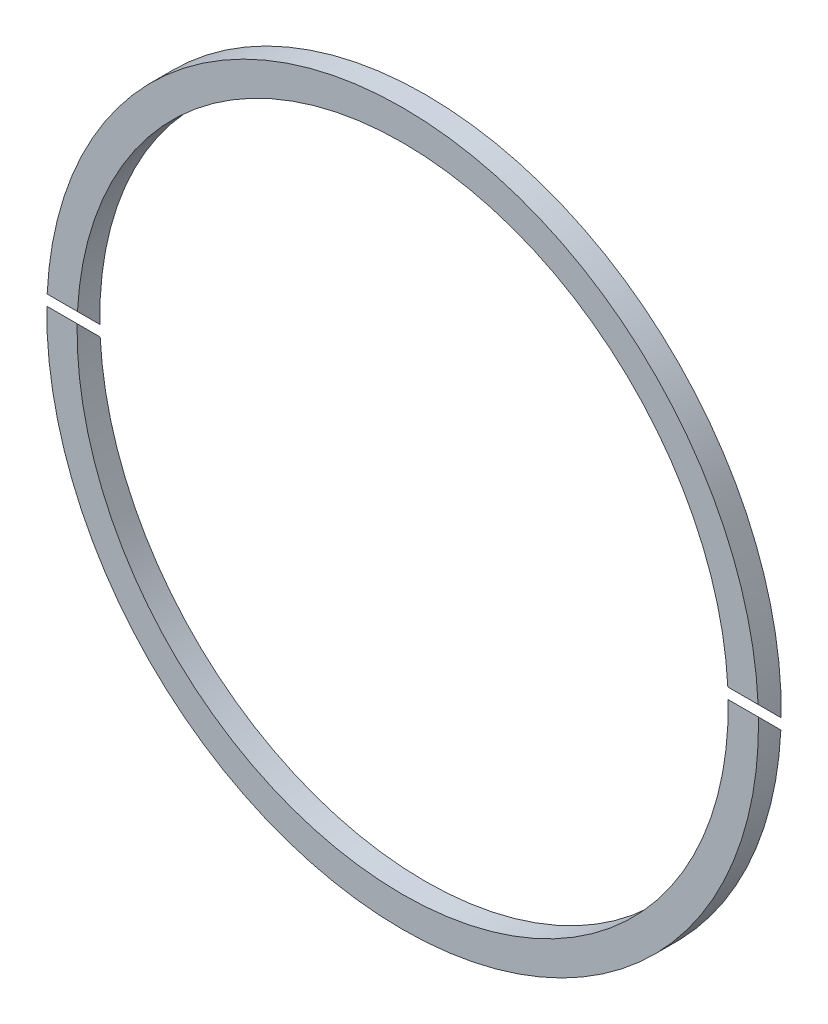
ISO-10303-21;
HEADER;
FILE_DESCRIPTION(('STEP AP214'),'2;1');
FILE_NAME('part.step','',(''),(''),'','','');
FILE_SCHEMA(('AUTOMOTIVE_DESIGN { 1 0 10303 214 1 1 1 1 }'));
ENDSEC;
DATA;
#1=APPLICATION_CONTEXT('core data for automotive mechanical design processes');
#2=APPLICATION_PROTOCOL_DEFINITION('international standard','automotive_design',2000,#1);
#3=PRODUCT_CONTEXT('',#1,'mechanical');
#4=PRODUCT('Part','Part','',(#3));
#5=PRODUCT_RELATED_PRODUCT_CATEGORY('part','',(#4));
#6=PRODUCT_DEFINITION_FORMATION('','',#4);
#7=PRODUCT_DEFINITION_CONTEXT('part definition',#1,'design');
#8=PRODUCT_DEFINITION('design','',#6,#7);
#9=PRODUCT_DEFINITION_SHAPE('','',#8);
#10=(LENGTH_UNIT() NAMED_UNIT(*) SI_UNIT(.MILLI.,.METRE.));
#11=(NAMED_UNIT(*) PLANE_ANGLE_UNIT() SI_UNIT($,.RADIAN.));
#12=(NAMED_UNIT(*) SI_UNIT($,.STERADIAN.) SOLID_ANGLE_UNIT());
#13=UNCERTAINTY_MEASURE_WITH_UNIT(LENGTH_MEASURE(1.E-05),#10,'distance_accuracy_value','');
#14=(GEOMETRIC_REPRESENTATION_CONTEXT(3) GLOBAL_UNCERTAINTY_ASSIGNED_CONTEXT((#13)) GLOBAL_UNIT_ASSIGNED_CONTEXT((#10,
#11,#12)) REPRESENTATION_CONTEXT('',''));
#15=CARTESIAN_POINT('',(0.,0.,0.));
#16=DIRECTION('',(0.,0.,1.));
#17=DIRECTION('',(1.,0.,0.));
#18=AXIS2_PLACEMENT_3D('',#15,#16,#17);
#19=CARTESIAN_POINT('',(0.,0.,1.5));
#20=DIRECTION('',(0.,0.,1.));
#21=DIRECTION('',(1.,0.,0.));
#22=AXIS2_PLACEMENT_3D('',#19,#20,#21);
#23=PLANE('',#22);
#24=DIRECTION('',(-1.,0.,0.));
#25=VECTOR('',#24,1.);
#26=CARTESIAN_POINT('',(0.,2.20710678118654,1.5));
#27=LINE('',#26,#25);
#28=CARTESIAN_POINT('',(46.9481488416364,2.20710678118654,1.5));
#29=VERTEX_POINT('',#28);
#30=CARTESIAN_POINT('',(42.9433193833039,2.20710678118654,1.5));
#31=VERTEX_POINT('',#30);
#32=EDGE_CURVE('E61',#29,#31,#27,.T.);
#33=ORIENTED_EDGE('',*,*,#32,.F.);
#34=CARTESIAN_POINT('',(0.,0.,1.5));
#35=DIRECTION('',(0.,0.,1.));
#36=DIRECTION('',(1.,0.,0.));
#37=AXIS2_PLACEMENT_3D('',#34,#35,#36);
#38=CIRCLE('',#37,47.);
#39=CARTESIAN_POINT('',(-46.9481488416364,2.20710678118654,1.5));
#40=VERTEX_POINT('',#39);
#41=EDGE_CURVE('E116',#29,#40,#38,.T.);
#42=ORIENTED_EDGE('',*,*,#41,.T.);
#43=CARTESIAN_POINT('',(-42.9433193833039,2.20710678118654,1.5));
#44=VERTEX_POINT('',#43);
#45=EDGE_CURVE('E12',#44,#40,#27,.T.);
#46=ORIENTED_EDGE('',*,*,#45,.F.);
#47=CARTESIAN_POINT('',(0.,0.,1.5));
#48=DIRECTION('',(0.,0.,1.));
#49=DIRECTION('',(1.,0.,0.));
#50=AXIS2_PLACEMENT_3D('',#47,#48,#49);
#51=CIRCLE('',#50,43.);
#52=EDGE_CURVE('E103',#31,#44,#51,.T.);
#53=ORIENTED_EDGE('',*,*,#52,.F.);
#54=EDGE_LOOP('',(#33,#42,#46,#53));
#55=FACE_BOUND('',#54,.T.);
#56=ADVANCED_FACE('F49',(#55),#23,.T.);
#57=CARTESIAN_POINT('',(0.,0.,-1.5));
#58=DIRECTION('',(0.,0.,1.));
#59=DIRECTION('',(1.,0.,0.));
#60=AXIS2_PLACEMENT_3D('',#57,#58,#59);
#61=PLANE('',#60);
#62=CARTESIAN_POINT('',(0.,0.,-1.5));
#63=DIRECTION('',(0.,0.,1.));
#64=DIRECTION('',(1.,0.,0.));
#65=AXIS2_PLACEMENT_3D('',#62,#63,#64);
#66=CIRCLE('',#65,47.);
#67=CARTESIAN_POINT('',(46.9933114426251,-0.792893218813452,-1.5));
#68=VERTEX_POINT('',#67);
#69=CARTESIAN_POINT('',(-46.9933114426251,-0.792893218813452,-1.5));
#70=VERTEX_POINT('',#69);
#71=EDGE_CURVE('E122',#68,#70,#66,.T.);
#72=ORIENTED_EDGE('',*,*,#71,.F.);
#73=DIRECTION('',(-1.,0.,0.));
#74=VECTOR('',#73,1.);
#75=CARTESIAN_POINT('',(0.,-0.792893218813452,-1.5));
#76=LINE('',#75,#74);
#77=CARTESIAN_POINT('',(42.9926891499422,-0.792893218813453,-1.5));
#78=VERTEX_POINT('',#77);
#79=EDGE_CURVE('E105',#68,#78,#76,.T.);
#80=ORIENTED_EDGE('',*,*,#79,.T.);
#81=CARTESIAN_POINT('',(0.,0.,-1.5));
#82=DIRECTION('',(0.,0.,1.));
#83=DIRECTION('',(1.,0.,0.));
#84=AXIS2_PLACEMENT_3D('',#81,#82,#83);
#85=CIRCLE('',#84,43.);
#86=CARTESIAN_POINT('',(-42.9926891499422,-0.792893218813453,-1.5));
#87=VERTEX_POINT('',#86);
#88=EDGE_CURVE('E52',#78,#87,#85,.T.);
#89=ORIENTED_EDGE('',*,*,#88,.T.);
#90=EDGE_CURVE('E95',#87,#70,#76,.T.);
#91=ORIENTED_EDGE('',*,*,#90,.T.);
#92=EDGE_LOOP('',(#72,#80,#89,#91));
#93=FACE_BOUND('',#92,.T.);
#94=ADVANCED_FACE('F113',(#93),#61,.F.);
#95=CARTESIAN_POINT('',(0.,0.,1.5));
#96=DIRECTION('',(0.,0.,-1.));
#97=DIRECTION('',(-1.,0.,0.));
#98=AXIS2_PLACEMENT_3D('',#95,#96,#97);
#99=CYLINDRICAL_SURFACE('',#98,43.);
#100=CARTESIAN_POINT('',(0.,0.,-0.707106781186546));
#101=DIRECTION('',(0.,0.707106781186548,-0.707106781186547));
#102=DIRECTION('',(0.,-0.707106781186547,-0.707106781186548));
#103=AXIS2_PLACEMENT_3D('',#100,#101,#102);
#104=ELLIPSE('',#103,60.8111831820431,43.);
#105=EDGE_CURVE('E59',#87,#44,#104,.T.);
#106=ORIENTED_EDGE('',*,*,#105,.F.);
#107=ORIENTED_EDGE('',*,*,#88,.F.);
#108=EDGE_CURVE('E91',#31,#78,#104,.T.);
#109=ORIENTED_EDGE('',*,*,#108,.F.);
#110=ORIENTED_EDGE('',*,*,#52,.T.);
#111=EDGE_LOOP('',(#106,#107,#109,#110));
#112=FACE_BOUND('',#111,.T.);
#113=ADVANCED_FACE('F109',(#112),#99,.F.);
#114=CARTESIAN_POINT('',(0.,0.,1.5));
#115=DIRECTION('',(0.,0.,-1.));
#116=DIRECTION('',(-1.,0.,0.));
#117=AXIS2_PLACEMENT_3D('',#114,#115,#116);
#118=CYLINDRICAL_SURFACE('',#117,47.);
#119=ORIENTED_EDGE('',*,*,#71,.T.);
#120=CARTESIAN_POINT('',(0.,0.,-0.707106781186546));
#121=DIRECTION('',(0.,0.707106781186548,-0.707106781186547));
#122=DIRECTION('',(0.,-0.707106781186547,-0.707106781186548));
#123=AXIS2_PLACEMENT_3D('',#120,#121,#122);
#124=ELLIPSE('',#123,66.4680374315355,47.);
#125=EDGE_CURVE('E68',#70,#40,#124,.T.);
#126=ORIENTED_EDGE('',*,*,#125,.T.);
#127=ORIENTED_EDGE('',*,*,#41,.F.);
#128=EDGE_CURVE('E84',#29,#68,#124,.T.);
#129=ORIENTED_EDGE('',*,*,#128,.T.);
#130=EDGE_LOOP('',(#119,#126,#127,#129));
#131=FACE_BOUND('',#130,.T.);
#132=ADVANCED_FACE('F129',(#131),#118,.T.);
#133=CARTESIAN_POINT('',(-47.,-5.81359061928345,-6.52069740047));
#134=DIRECTION('',(0.,0.707106781186548,-0.707106781186547));
#135=DIRECTION('',(0.,0.707106781186547,0.707106781186548));
#136=AXIS2_PLACEMENT_3D('',#133,#134,#135);
#137=PLANE('',#136);
#138=ORIENTED_EDGE('',*,*,#32,.T.);
#139=ORIENTED_EDGE('',*,*,#108,.T.);
#140=ORIENTED_EDGE('',*,*,#79,.F.);
#141=ORIENTED_EDGE('',*,*,#128,.F.);
#142=EDGE_LOOP('',(#138,#139,#140,#141));
#143=FACE_BOUND('',#142,.T.);
#144=ADVANCED_FACE('F141',(#143),#137,.F.);
#145=ORIENTED_EDGE('',*,*,#90,.F.);
#146=ORIENTED_EDGE('',*,*,#105,.T.);
#147=ORIENTED_EDGE('',*,*,#45,.T.);
#148=ORIENTED_EDGE('',*,*,#125,.F.);
#149=EDGE_LOOP('',(#145,#146,#147,#148));
#150=FACE_BOUND('',#149,.T.);
#151=ADVANCED_FACE('F97',(#150),#137,.F.);
#152=CLOSED_SHELL('',(#56,#94,#113,#132,#144,#151));
#153=MANIFOLD_SOLID_BREP('B2',#152);
#154=CARTESIAN_POINT('',(0.,0.,1.5));
#155=DIRECTION('',(0.,0.,-1.));
#156=DIRECTION('',(-1.,0.,0.));
#157=AXIS2_PLACEMENT_3D('',#154,#155,#156);
#158=CYLINDRICAL_SURFACE('',#157,43.);
#159=CARTESIAN_POINT('',(0.,0.,0.707106781186548));
#160=DIRECTION('',(0.,-0.707106781186547,0.707106781186547));
#161=DIRECTION('',(0.,-0.707106781186548,-0.707106781186548));
#162=AXIS2_PLACEMENT_3D('',#159,#160,#161);
#163=ELLIPSE('',#162,60.8111831820431,43.);
#164=CARTESIAN_POINT('',(42.9433193833039,-2.20710678118655,-1.5));
#165=VERTEX_POINT('',#164);
#166=CARTESIAN_POINT('',(42.9926891499422,0.792893218813452,1.5));
#167=VERTEX_POINT('',#166);
#168=EDGE_CURVE('E47',#165,#167,#163,.T.);
#169=ORIENTED_EDGE('',*,*,#168,.F.);
#170=CARTESIAN_POINT('',(0.,0.,-1.5));
#171=DIRECTION('',(0.,0.,1.));
#172=DIRECTION('',(1.,0.,0.));
#173=AXIS2_PLACEMENT_3D('',#170,#171,#172);
#174=CIRCLE('',#173,43.);
#175=CARTESIAN_POINT('',(-42.9433193833039,-2.20710678118655,-1.5));
#176=VERTEX_POINT('',#175);
#177=EDGE_CURVE('E230',#176,#165,#174,.T.);
#178=ORIENTED_EDGE('',*,*,#177,.F.);
#179=CARTESIAN_POINT('',(-42.9926891499422,0.792893218813452,1.5));
#180=VERTEX_POINT('',#179);
#181=EDGE_CURVE('E184',#180,#176,#163,.T.);
#182=ORIENTED_EDGE('',*,*,#181,.F.);
#183=CARTESIAN_POINT('',(0.,0.,1.5));
#184=DIRECTION('',(0.,0.,1.));
#185=DIRECTION('',(1.,0.,0.));
#186=AXIS2_PLACEMENT_3D('',#183,#184,#185);
#187=CIRCLE('',#186,43.);
#188=EDGE_CURVE('E234',#180,#167,#187,.T.);
#189=ORIENTED_EDGE('',*,*,#188,.T.);
#190=EDGE_LOOP('',(#169,#178,#182,#189));
#191=FACE_BOUND('',#190,.T.);
#192=ADVANCED_FACE('F180',(#191),#158,.F.);
#193=CARTESIAN_POINT('',(0.,0.,1.5));
#194=DIRECTION('',(0.,0.,-1.));
#195=DIRECTION('',(-1.,0.,0.));
#196=AXIS2_PLACEMENT_3D('',#193,#194,#195);
#197=CYLINDRICAL_SURFACE('',#196,47.);
#198=CARTESIAN_POINT('',(0.,0.,-1.5));
#199=DIRECTION('',(0.,0.,1.));
#200=DIRECTION('',(1.,0.,0.));
#201=AXIS2_PLACEMENT_3D('',#198,#199,#200);
#202=CIRCLE('',#201,47.);
#203=CARTESIAN_POINT('',(-46.9481488416364,-2.20710678118655,-1.5));
#204=VERTEX_POINT('',#203);
#205=CARTESIAN_POINT('',(46.9481488416364,-2.20710678118655,-1.5));
#206=VERTEX_POINT('',#205);
#207=EDGE_CURVE('E232',#204,#206,#202,.T.);
#208=ORIENTED_EDGE('',*,*,#207,.T.);
#209=CARTESIAN_POINT('',(0.,0.,0.707106781186548));
#210=DIRECTION('',(0.,-0.707106781186547,0.707106781186547));
#211=DIRECTION('',(0.,-0.707106781186548,-0.707106781186548));
#212=AXIS2_PLACEMENT_3D('',#209,#210,#211);
#213=ELLIPSE('',#212,66.4680374315355,47.);
#214=CARTESIAN_POINT('',(46.9933114426251,0.792893218813452,1.5));
#215=VERTEX_POINT('',#214);
#216=EDGE_CURVE('E235',#206,#215,#213,.T.);
#217=ORIENTED_EDGE('',*,*,#216,.T.);
#218=CARTESIAN_POINT('',(0.,0.,1.5));
#219=DIRECTION('',(0.,0.,1.));
#220=DIRECTION('',(1.,0.,0.));
#221=AXIS2_PLACEMENT_3D('',#218,#219,#220);
#222=CIRCLE('',#221,47.);
#223=CARTESIAN_POINT('',(-46.9933114426251,0.792893218813452,1.5));
#224=VERTEX_POINT('',#223);
#225=EDGE_CURVE('E226',#224,#215,#222,.T.);
#226=ORIENTED_EDGE('',*,*,#225,.F.);
#227=EDGE_CURVE('E240',#224,#204,#213,.T.);
#228=ORIENTED_EDGE('',*,*,#227,.T.);
#229=EDGE_LOOP('',(#208,#217,#226,#228));
#230=FACE_BOUND('',#229,.T.);
#231=ADVANCED_FACE('F182',(#230),#197,.T.);
#232=CARTESIAN_POINT('',(0.,0.,-1.5));
#233=DIRECTION('',(0.,0.,1.));
#234=DIRECTION('',(1.,0.,0.));
#235=AXIS2_PLACEMENT_3D('',#232,#233,#234);
#236=PLANE('',#235);
#237=ORIENTED_EDGE('',*,*,#207,.F.);
#238=DIRECTION('',(1.,0.,0.));
#239=VECTOR('',#238,1.);
#240=CARTESIAN_POINT('',(0.,-2.20710678118655,-1.5));
#241=LINE('',#240,#239);
#242=EDGE_CURVE('E220',#204,#176,#241,.T.);
#243=ORIENTED_EDGE('',*,*,#242,.T.);
#244=ORIENTED_EDGE('',*,*,#177,.T.);
#245=EDGE_CURVE('E194',#165,#206,#241,.T.);
#246=ORIENTED_EDGE('',*,*,#245,.T.);
#247=EDGE_LOOP('',(#237,#243,#244,#246));
#248=FACE_BOUND('',#247,.T.);
#249=ADVANCED_FACE('F229',(#248),#236,.F.);
#250=CARTESIAN_POINT('',(0.,0.,1.5));
#251=DIRECTION('',(0.,0.,1.));
#252=DIRECTION('',(1.,0.,0.));
#253=AXIS2_PLACEMENT_3D('',#250,#251,#252);
#254=PLANE('',#253);
#255=DIRECTION('',(1.,0.,0.));
#256=VECTOR('',#255,1.);
#257=CARTESIAN_POINT('',(0.,0.792893218813452,1.5));
#258=LINE('',#257,#256);
#259=EDGE_CURVE('E202',#224,#180,#258,.T.);
#260=ORIENTED_EDGE('',*,*,#259,.F.);
#261=ORIENTED_EDGE('',*,*,#225,.T.);
#262=EDGE_CURVE('E238',#167,#215,#258,.T.);
#263=ORIENTED_EDGE('',*,*,#262,.F.);
#264=ORIENTED_EDGE('',*,*,#188,.F.);
#265=EDGE_LOOP('',(#260,#261,#263,#264));
#266=FACE_BOUND('',#265,.T.);
#267=ADVANCED_FACE('F250',(#266),#254,.T.);
#268=CARTESIAN_POINT('',(-47.,3.35816677768413,4.06527355887068));
#269=DIRECTION('',(0.,-0.707106781186547,0.707106781186547));
#270=DIRECTION('',(0.,-0.707106781186548,-0.707106781186548));
#271=AXIS2_PLACEMENT_3D('',#268,#269,#270);
#272=PLANE('',#271);
#273=ORIENTED_EDGE('',*,*,#259,.T.);
#274=ORIENTED_EDGE('',*,*,#181,.T.);
#275=ORIENTED_EDGE('',*,*,#242,.F.);
#276=ORIENTED_EDGE('',*,*,#227,.F.);
#277=EDGE_LOOP('',(#273,#274,#275,#276));
#278=FACE_BOUND('',#277,.T.);
#279=ADVANCED_FACE('F219',(#278),#272,.F.);
#280=ORIENTED_EDGE('',*,*,#245,.F.);
#281=ORIENTED_EDGE('',*,*,#168,.T.);
#282=ORIENTED_EDGE('',*,*,#262,.T.);
#283=ORIENTED_EDGE('',*,*,#216,.F.);
#284=EDGE_LOOP('',(#280,#281,#282,#283));
#285=FACE_BOUND('',#284,.T.);
#286=ADVANCED_FACE('F248',(#285),#272,.F.);
#287=CLOSED_SHELL('',(#192,#231,#249,#267,#279,#286));
#288=MANIFOLD_SOLID_BREP('B6',#287);
#289=ADVANCED_BREP_SHAPE_REPRESENTATION('',(#18,#153,#288),#14);
#290=SHAPE_DEFINITION_REPRESENTATION(#9,#289);
ENDSEC;
END-ISO-10303-21;
